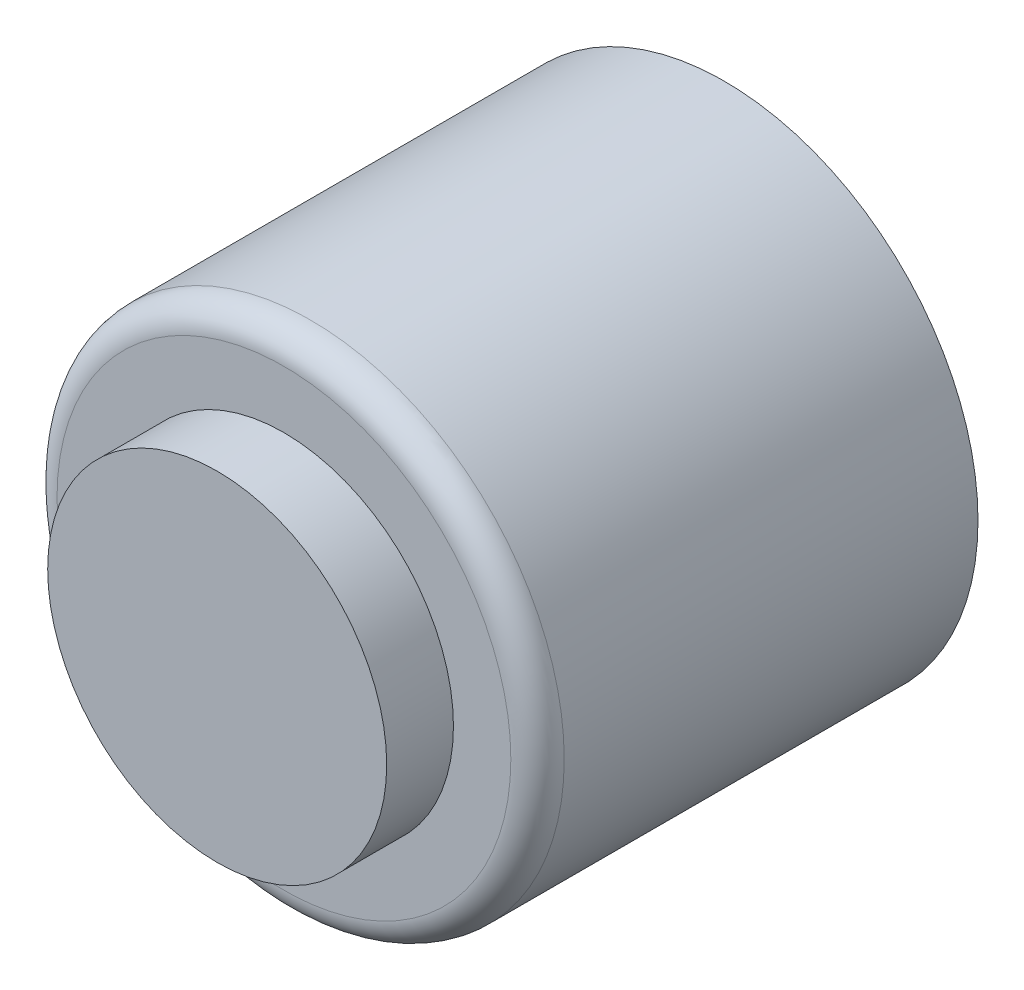
ISO-10303-21;
HEADER;
FILE_DESCRIPTION(('STEP AP214'),'2;1');
FILE_NAME('part.step','',(''),(''),'','','');
FILE_SCHEMA(('AUTOMOTIVE_DESIGN { 1 0 10303 214 1 1 1 1 }'));
ENDSEC;
DATA;
#1=APPLICATION_CONTEXT('core data for automotive mechanical design processes');
#2=APPLICATION_PROTOCOL_DEFINITION('international standard','automotive_design',2000,#1);
#3=PRODUCT_CONTEXT('',#1,'mechanical');
#4=PRODUCT('Part','Part','',(#3));
#5=PRODUCT_RELATED_PRODUCT_CATEGORY('part','',(#4));
#6=PRODUCT_DEFINITION_FORMATION('','',#4);
#7=PRODUCT_DEFINITION_CONTEXT('part definition',#1,'design');
#8=PRODUCT_DEFINITION('design','',#6,#7);
#9=PRODUCT_DEFINITION_SHAPE('','',#8);
#10=(LENGTH_UNIT() NAMED_UNIT(*) SI_UNIT(.MILLI.,.METRE.));
#11=(NAMED_UNIT(*) PLANE_ANGLE_UNIT() SI_UNIT($,.RADIAN.));
#12=(NAMED_UNIT(*) SI_UNIT($,.STERADIAN.) SOLID_ANGLE_UNIT());
#13=UNCERTAINTY_MEASURE_WITH_UNIT(LENGTH_MEASURE(1.E-05),#10,'distance_accuracy_value','');
#14=(GEOMETRIC_REPRESENTATION_CONTEXT(3) GLOBAL_UNCERTAINTY_ASSIGNED_CONTEXT((#13)) GLOBAL_UNIT_ASSIGNED_CONTEXT((#10,
#11,#12)) REPRESENTATION_CONTEXT('',''));
#15=CARTESIAN_POINT('',(0.,0.,0.));
#16=DIRECTION('',(0.,0.,1.));
#17=DIRECTION('',(1.,0.,0.));
#18=AXIS2_PLACEMENT_3D('',#15,#16,#17);
#19=CARTESIAN_POINT('',(0.,0.,0.));
#20=DIRECTION('',(0.,0.,1.));
#21=DIRECTION('',(1.,0.,0.));
#22=AXIS2_PLACEMENT_3D('',#19,#20,#21);
#23=PLANE('',#22);
#24=CARTESIAN_POINT('',(0.,0.,0.));
#25=DIRECTION('',(0.,0.,1.));
#26=DIRECTION('',(1.,0.,0.));
#27=AXIS2_PLACEMENT_3D('',#24,#25,#26);
#28=CIRCLE('',#27,12.7);
#29=CARTESIAN_POINT('',(12.7,0.,0.));
#30=VERTEX_POINT('',#29);
#31=EDGE_CURVE('E43',#30,#30,#28,.T.);
#32=ORIENTED_EDGE('',*,*,#31,.T.);
#33=EDGE_LOOP('',(#32));
#34=FACE_BOUND('',#33,.T.);
#35=ADVANCED_FACE('F32',(#34),#23,.T.);
#36=CARTESIAN_POINT('',(0.,0.,0.));
#37=DIRECTION('',(0.,0.,1.));
#38=DIRECTION('',(1.,0.,0.));
#39=AXIS2_PLACEMENT_3D('',#36,#37,#38);
#40=CYLINDRICAL_SURFACE('',#39,12.7);
#41=CARTESIAN_POINT('',(0.,0.,-5.));
#42=DIRECTION('',(0.,0.,1.));
#43=DIRECTION('',(1.,0.,0.));
#44=AXIS2_PLACEMENT_3D('',#41,#42,#43);
#45=CIRCLE('',#44,12.7);
#46=CARTESIAN_POINT('',(12.7,0.,-5.));
#47=VERTEX_POINT('',#46);
#48=EDGE_CURVE('E47',#47,#47,#45,.T.);
#49=ORIENTED_EDGE('',*,*,#48,.T.);
#50=EDGE_LOOP('',(#49));
#51=FACE_BOUND('',#50,.T.);
#52=ORIENTED_EDGE('',*,*,#31,.F.);
#53=EDGE_LOOP('',(#52));
#54=FACE_BOUND('',#53,.T.);
#55=ADVANCED_FACE('F76',(#51,#54),#40,.T.);
#56=CARTESIAN_POINT('',(0.,-12.7,-5.));
#57=DIRECTION('',(0.,0.,1.));
#58=DIRECTION('',(1.,0.,0.));
#59=AXIS2_PLACEMENT_3D('',#56,#57,#58);
#60=PLANE('',#59);
#61=CARTESIAN_POINT('',(0.,0.,-5.));
#62=DIRECTION('',(0.,0.,1.));
#63=DIRECTION('',(1.,0.,0.));
#64=AXIS2_PLACEMENT_3D('',#61,#62,#63);
#65=CIRCLE('',#64,17.);
#66=CARTESIAN_POINT('',(17.,0.,-5.));
#67=VERTEX_POINT('',#66);
#68=EDGE_CURVE('E39',#67,#67,#65,.T.);
#69=ORIENTED_EDGE('',*,*,#68,.T.);
#70=EDGE_LOOP('',(#69));
#71=FACE_BOUND('',#70,.T.);
#72=ORIENTED_EDGE('',*,*,#48,.F.);
#73=EDGE_LOOP('',(#72));
#74=FACE_BOUND('',#73,.T.);
#75=ADVANCED_FACE('F81',(#71,#74),#60,.T.);
#76=CARTESIAN_POINT('',(0.,0.,0.));
#77=DIRECTION('',(0.,0.,1.));
#78=DIRECTION('',(1.,0.,0.));
#79=AXIS2_PLACEMENT_3D('',#76,#77,#78);
#80=CYLINDRICAL_SURFACE('',#79,19.);
#81=CARTESIAN_POINT('',(0.,0.,-7.));
#82=DIRECTION('',(0.,0.,1.));
#83=DIRECTION('',(1.,0.,0.));
#84=AXIS2_PLACEMENT_3D('',#81,#82,#83);
#85=CIRCLE('',#84,19.);
#86=CARTESIAN_POINT('',(19.,0.,-7.));
#87=VERTEX_POINT('',#86);
#88=EDGE_CURVE('E10',#87,#87,#85,.F.);
#89=ORIENTED_EDGE('',*,*,#88,.T.);
#90=EDGE_LOOP('',(#89));
#91=FACE_BOUND('',#90,.T.);
#92=CARTESIAN_POINT('',(0.,0.,-38.));
#93=DIRECTION('',(0.,0.,1.));
#94=DIRECTION('',(1.,0.,0.));
#95=AXIS2_PLACEMENT_3D('',#92,#93,#94);
#96=CIRCLE('',#95,19.);
#97=CARTESIAN_POINT('',(19.,0.,-38.));
#98=VERTEX_POINT('',#97);
#99=EDGE_CURVE('E52',#98,#98,#96,.T.);
#100=ORIENTED_EDGE('',*,*,#99,.T.);
#101=EDGE_LOOP('',(#100));
#102=FACE_BOUND('',#101,.T.);
#103=ADVANCED_FACE('F87',(#91,#102),#80,.T.);
#104=CARTESIAN_POINT('',(0.,-19.,-38.));
#105=DIRECTION('',(0.,0.,-1.));
#106=DIRECTION('',(-1.,0.,0.));
#107=AXIS2_PLACEMENT_3D('',#104,#105,#106);
#108=PLANE('',#107);
#109=CARTESIAN_POINT('',(0.,0.,-38.));
#110=DIRECTION('',(0.,0.,1.));
#111=DIRECTION('',(1.,0.,0.));
#112=AXIS2_PLACEMENT_3D('',#109,#110,#111);
#113=CIRCLE('',#112,18.);
#114=CARTESIAN_POINT('',(18.,0.,-38.));
#115=VERTEX_POINT('',#114);
#116=EDGE_CURVE('E55',#115,#115,#113,.T.);
#117=ORIENTED_EDGE('',*,*,#116,.T.);
#118=EDGE_LOOP('',(#117));
#119=FACE_BOUND('',#118,.T.);
#120=ORIENTED_EDGE('',*,*,#99,.F.);
#121=EDGE_LOOP('',(#120));
#122=FACE_BOUND('',#121,.T.);
#123=ADVANCED_FACE('F73',(#119,#122),#108,.T.);
#124=CARTESIAN_POINT('',(0.,0.,-38.));
#125=DIRECTION('',(0.,0.,-1.));
#126=DIRECTION('',(-1.,0.,0.));
#127=AXIS2_PLACEMENT_3D('',#124,#125,#126);
#128=CONICAL_SURFACE('',#127,18.,0.785398163397443);
#129=CARTESIAN_POINT('',(0.,0.,-34.51743479135));
#130=DIRECTION('',(0.,0.,1.));
#131=DIRECTION('',(1.,0.,0.));
#132=AXIS2_PLACEMENT_3D('',#129,#130,#131);
#133=CIRCLE('',#132,14.51743479135);
#134=CARTESIAN_POINT('',(14.51743479135,0.,-34.51743479135));
#135=VERTEX_POINT('',#134);
#136=EDGE_CURVE('E58',#135,#135,#133,.T.);
#137=ORIENTED_EDGE('',*,*,#136,.T.);
#138=EDGE_LOOP('',(#137));
#139=FACE_BOUND('',#138,.T.);
#140=ORIENTED_EDGE('',*,*,#116,.F.);
#141=EDGE_LOOP('',(#140));
#142=FACE_BOUND('',#141,.T.);
#143=ADVANCED_FACE('F62',(#139,#142),#128,.F.);
#144=CARTESIAN_POINT('',(0.,0.,-6.));
#145=DIRECTION('',(0.,0.,1.));
#146=DIRECTION('',(0.,-1.,0.));
#147=AXIS2_PLACEMENT_3D('',#144,#145,#146);
#148=SPHERICAL_SURFACE('',#147,32.);
#149=ORIENTED_EDGE('',*,*,#136,.F.);
#150=EDGE_LOOP('',(#149));
#151=FACE_BOUND('',#150,.T.);
#152=ADVANCED_FACE('F65',(#151),#148,.T.);
#153=CARTESIAN_POINT('',(0.,0.,-7.));
#154=DIRECTION('',(0.,0.,1.));
#155=DIRECTION('',(1.,0.,0.));
#156=AXIS2_PLACEMENT_3D('',#153,#154,#155);
#157=TOROIDAL_SURFACE('',#156,17.,2.);
#158=ORIENTED_EDGE('',*,*,#88,.F.);
#159=EDGE_LOOP('',(#158));
#160=FACE_BOUND('',#159,.T.);
#161=ORIENTED_EDGE('',*,*,#68,.F.);
#162=EDGE_LOOP('',(#161));
#163=FACE_BOUND('',#162,.T.);
#164=ADVANCED_FACE('F34',(#160,#163),#157,.T.);
#165=CLOSED_SHELL('',(#35,#55,#75,#103,#123,#143,#152,#164));
#166=MANIFOLD_SOLID_BREP('B2',#165);
#167=ADVANCED_BREP_SHAPE_REPRESENTATION('',(#18,#166),#14);
#168=SHAPE_DEFINITION_REPRESENTATION(#9,#167);
ENDSEC;
END-ISO-10303-21;
